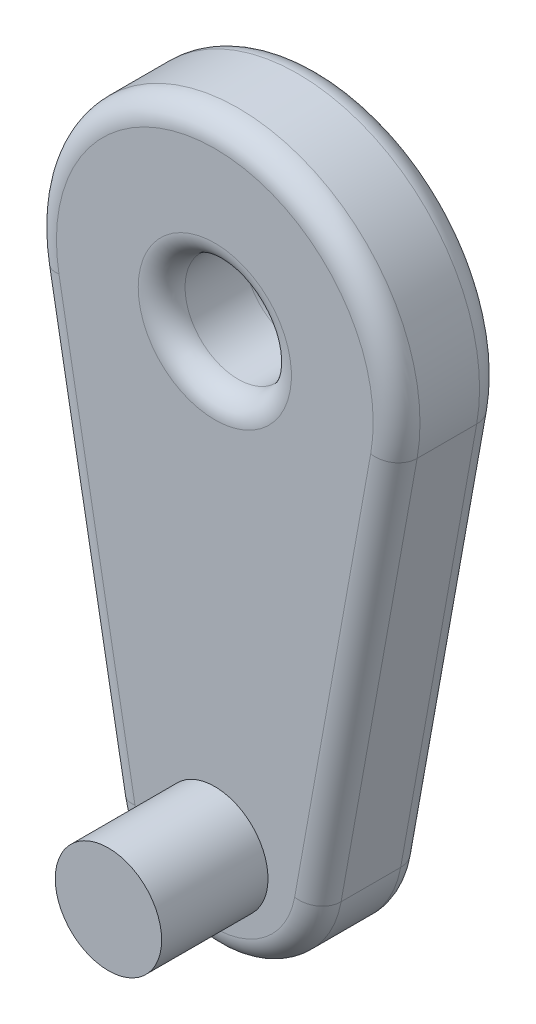
ISO-10303-21;
HEADER;
FILE_DESCRIPTION(('STEP AP214'),'2;1');
FILE_NAME('part.step','',(''),(''),'','','');
FILE_SCHEMA(('AUTOMOTIVE_DESIGN { 1 0 10303 214 1 1 1 1 }'));
ENDSEC;
DATA;
#1=APPLICATION_CONTEXT('core data for automotive mechanical design processes');
#2=APPLICATION_PROTOCOL_DEFINITION('international standard','automotive_design',2000,#1);
#3=PRODUCT_CONTEXT('',#1,'mechanical');
#4=PRODUCT('Part','Part','',(#3));
#5=PRODUCT_RELATED_PRODUCT_CATEGORY('part','',(#4));
#6=PRODUCT_DEFINITION_FORMATION('','',#4);
#7=PRODUCT_DEFINITION_CONTEXT('part definition',#1,'design');
#8=PRODUCT_DEFINITION('design','',#6,#7);
#9=PRODUCT_DEFINITION_SHAPE('','',#8);
#10=(LENGTH_UNIT() NAMED_UNIT(*) SI_UNIT(.MILLI.,.METRE.));
#11=(NAMED_UNIT(*) PLANE_ANGLE_UNIT() SI_UNIT($,.RADIAN.));
#12=(NAMED_UNIT(*) SI_UNIT($,.STERADIAN.) SOLID_ANGLE_UNIT());
#13=UNCERTAINTY_MEASURE_WITH_UNIT(LENGTH_MEASURE(1.E-05),#10,'distance_accuracy_value','');
#14=(GEOMETRIC_REPRESENTATION_CONTEXT(3) GLOBAL_UNCERTAINTY_ASSIGNED_CONTEXT((#13)) GLOBAL_UNIT_ASSIGNED_CONTEXT((#10,
#11,#12)) REPRESENTATION_CONTEXT('',''));
#15=CARTESIAN_POINT('',(0.,0.,0.));
#16=DIRECTION('',(0.,0.,1.));
#17=DIRECTION('',(1.,0.,0.));
#18=AXIS2_PLACEMENT_3D('',#15,#16,#17);
#19=CARTESIAN_POINT('',(0.,3.19993703416853,5.));
#20=DIRECTION('',(0.,0.,-1.));
#21=DIRECTION('',(-1.,0.,0.));
#22=AXIS2_PLACEMENT_3D('',#19,#20,#21);
#23=PLANE('',#22);
#24=CARTESIAN_POINT('',(0.,-17.8259501759452,5.));
#25=DIRECTION('',(0.,0.,-1.));
#26=DIRECTION('',(-1.,0.,0.));
#27=AXIS2_PLACEMENT_3D('',#24,#25,#26);
#28=CIRCLE('',#27,2.5);
#29=CARTESIAN_POINT('',(-2.5,-17.8259501759452,5.));
#30=VERTEX_POINT('',#29);
#31=EDGE_CURVE('E11',#30,#30,#28,.F.);
#32=ORIENTED_EDGE('',*,*,#31,.F.);
#33=EDGE_LOOP('',(#32));
#34=FACE_BOUND('',#33,.T.);
#35=CARTESIAN_POINT('',(0.,3.19993703416853,5.));
#36=DIRECTION('',(0.,0.,-1.));
#37=DIRECTION('',(-1.,0.,0.));
#38=AXIS2_PLACEMENT_3D('',#35,#36,#37);
#39=CIRCLE('',#38,3.6);
#40=CARTESIAN_POINT('',(-3.6,3.19993703416853,5.));
#41=VERTEX_POINT('',#40);
#42=EDGE_CURVE('E48',#41,#41,#39,.T.);
#43=ORIENTED_EDGE('',*,*,#42,.T.);
#44=EDGE_LOOP('',(#43));
#45=FACE_BOUND('',#44,.T.);
#46=CARTESIAN_POINT('',(0.,-17.277744472732,5.));
#47=DIRECTION('',(0.,0.,-1.));
#48=DIRECTION('',(-1.,0.,0.));
#49=AXIS2_PLACEMENT_3D('',#46,#47,#48);
#50=CIRCLE('',#49,3.81390108027206);
#51=CARTESIAN_POINT('',(-3.7534757200465,-17.9539555855672,5.));
#52=VERTEX_POINT('',#51);
#53=CARTESIAN_POINT('',(3.7534757200465,-17.9539555855672,5.));
#54=VERTEX_POINT('',#53);
#55=EDGE_CURVE('E55',#52,#54,#50,.F.);
#56=ORIENTED_EDGE('',*,*,#55,.T.);
#57=DIRECTION('',(0.177301691523409,0.984156547599485,0.));
#58=VECTOR('',#57,1.);
#59=CARTESIAN_POINT('',(7.3266800302686,1.87999178177352,5.));
#60=LINE('',#59,#58);
#61=CARTESIAN_POINT('',(7.3266800302686,1.87999178177352,5.));
#62=VERTEX_POINT('',#61);
#63=EDGE_CURVE('E183',#54,#62,#60,.T.);
#64=ORIENTED_EDGE('',*,*,#63,.T.);
#65=CARTESIAN_POINT('',(0.,3.19993703416853,5.));
#66=DIRECTION('',(0.,0.,-1.));
#67=DIRECTION('',(-1.,0.,0.));
#68=AXIS2_PLACEMENT_3D('',#65,#66,#67);
#69=CIRCLE('',#68,7.44462864992317);
#70=CARTESIAN_POINT('',(-7.3266800302686,1.87999178177352,5.));
#71=VERTEX_POINT('',#70);
#72=EDGE_CURVE('E176',#62,#71,#69,.F.);
#73=ORIENTED_EDGE('',*,*,#72,.T.);
#74=DIRECTION('',(0.177301691523409,-0.984156547599485,0.));
#75=VECTOR('',#74,1.);
#76=CARTESIAN_POINT('',(-7.3266800302686,1.87999178177352,5.));
#77=LINE('',#76,#75);
#78=EDGE_CURVE('E60',#71,#52,#77,.T.);
#79=ORIENTED_EDGE('',*,*,#78,.T.);
#80=EDGE_LOOP('',(#56,#64,#73,#79));
#81=FACE_BOUND('',#80,.T.);
#82=ADVANCED_FACE('F39',(#34,#45,#81),#23,.F.);
#83=CARTESIAN_POINT('',(0.,3.19993703416853,0.));
#84=DIRECTION('',(0.,0.,-1.));
#85=DIRECTION('',(-1.,0.,0.));
#86=AXIS2_PLACEMENT_3D('',#83,#84,#85);
#87=PLANE('',#86);
#88=CARTESIAN_POINT('',(0.,3.19993703416853,0.));
#89=DIRECTION('',(0.,0.,-1.));
#90=DIRECTION('',(-1.,0.,0.));
#91=AXIS2_PLACEMENT_3D('',#88,#89,#90);
#92=CIRCLE('',#91,3.6);
#93=CARTESIAN_POINT('',(-3.6,3.19993703416853,0.));
#94=VERTEX_POINT('',#93);
#95=EDGE_CURVE('E135',#94,#94,#92,.F.);
#96=ORIENTED_EDGE('',*,*,#95,.T.);
#97=EDGE_LOOP('',(#96));
#98=FACE_BOUND('',#97,.T.);
#99=CARTESIAN_POINT('',(0.,-17.277744472732,0.));
#100=DIRECTION('',(0.,0.,-1.));
#101=DIRECTION('',(-1.,0.,0.));
#102=AXIS2_PLACEMENT_3D('',#99,#100,#101);
#103=CIRCLE('',#102,3.81390108027206);
#104=CARTESIAN_POINT('',(3.7534757200465,-17.9539555855672,0.));
#105=VERTEX_POINT('',#104);
#106=CARTESIAN_POINT('',(-3.7534757200465,-17.9539555855672,0.));
#107=VERTEX_POINT('',#106);
#108=EDGE_CURVE('E133',#105,#107,#103,.T.);
#109=ORIENTED_EDGE('',*,*,#108,.T.);
#110=DIRECTION('',(0.177301691523409,-0.984156547599485,0.));
#111=VECTOR('',#110,1.);
#112=CARTESIAN_POINT('',(-7.3266800302686,1.87999178177352,0.));
#113=LINE('',#112,#111);
#114=CARTESIAN_POINT('',(-7.3266800302686,1.87999178177352,0.));
#115=VERTEX_POINT('',#114);
#116=EDGE_CURVE('E110',#107,#115,#113,.F.);
#117=ORIENTED_EDGE('',*,*,#116,.T.);
#118=CARTESIAN_POINT('',(0.,3.19993703416853,0.));
#119=DIRECTION('',(0.,0.,-1.));
#120=DIRECTION('',(-1.,0.,0.));
#121=AXIS2_PLACEMENT_3D('',#118,#119,#120);
#122=CIRCLE('',#121,7.44462864992317);
#123=CARTESIAN_POINT('',(7.3266800302686,1.87999178177352,0.));
#124=VERTEX_POINT('',#123);
#125=EDGE_CURVE('E121',#115,#124,#122,.T.);
#126=ORIENTED_EDGE('',*,*,#125,.T.);
#127=DIRECTION('',(0.177301691523409,0.984156547599485,0.));
#128=VECTOR('',#127,1.);
#129=CARTESIAN_POINT('',(3.7534757200465,-17.9539555855672,0.));
#130=LINE('',#129,#128);
#131=EDGE_CURVE('E128',#124,#105,#130,.F.);
#132=ORIENTED_EDGE('',*,*,#131,.T.);
#133=EDGE_LOOP('',(#109,#117,#126,#132));
#134=FACE_BOUND('',#133,.T.);
#135=ADVANCED_FACE('F131',(#98,#134),#87,.T.);
#136=CARTESIAN_POINT('',(0.,3.19993703416853,5.));
#137=DIRECTION('',(0.,0.,-1.));
#138=DIRECTION('',(-1.,0.,0.));
#139=AXIS2_PLACEMENT_3D('',#136,#137,#138);
#140=CYLINDRICAL_SURFACE('',#139,8.54462864992317);
#141=DIRECTION('',(0.,0.,-1.));
#142=VECTOR('',#141,1.);
#143=CARTESIAN_POINT('',(8.40925223262804,1.68495992109777,5.));
#144=LINE('',#143,#142);
#145=CARTESIAN_POINT('',(8.40925223262804,1.68495992109777,3.9));
#146=VERTEX_POINT('',#145);
#147=CARTESIAN_POINT('',(8.40925223262804,1.68495992109777,1.1));
#148=VERTEX_POINT('',#147);
#149=EDGE_CURVE('E197',#146,#148,#144,.T.);
#150=ORIENTED_EDGE('',*,*,#149,.T.);
#151=CARTESIAN_POINT('',(0.,3.19993703416853,1.1));
#152=DIRECTION('',(0.,0.,-1.));
#153=DIRECTION('',(-1.,0.,0.));
#154=AXIS2_PLACEMENT_3D('',#151,#152,#153);
#155=CIRCLE('',#154,8.54462864992317);
#156=CARTESIAN_POINT('',(-8.40925223262804,1.68495992109777,1.1));
#157=VERTEX_POINT('',#156);
#158=EDGE_CURVE('E173',#148,#157,#155,.F.);
#159=ORIENTED_EDGE('',*,*,#158,.T.);
#160=DIRECTION('',(0.,0.,-1.));
#161=VECTOR('',#160,1.);
#162=CARTESIAN_POINT('',(-8.40925223262804,1.68495992109777,5.));
#163=LINE('',#162,#161);
#164=CARTESIAN_POINT('',(-8.40925223262804,1.68495992109777,3.9));
#165=VERTEX_POINT('',#164);
#166=EDGE_CURVE('E129',#165,#157,#163,.T.);
#167=ORIENTED_EDGE('',*,*,#166,.F.);
#168=CARTESIAN_POINT('',(0.,3.19993703416853,3.9));
#169=DIRECTION('',(0.,0.,-1.));
#170=DIRECTION('',(-1.,0.,0.));
#171=AXIS2_PLACEMENT_3D('',#168,#169,#170);
#172=CIRCLE('',#171,8.54462864992317);
#173=EDGE_CURVE('E170',#165,#146,#172,.T.);
#174=ORIENTED_EDGE('',*,*,#173,.T.);
#175=EDGE_LOOP('',(#150,#159,#167,#174));
#176=FACE_BOUND('',#175,.T.);
#177=ADVANCED_FACE('F226',(#176),#140,.T.);
#178=CARTESIAN_POINT('',(-8.40925223262804,1.68495992109777,5.));
#179=DIRECTION('',(0.984156547599485,0.177301691523409,0.));
#180=DIRECTION('',(-0.177301691523409,0.984156547599485,0.));
#181=AXIS2_PLACEMENT_3D('',#178,#179,#180);
#182=PLANE('',#181);
#183=ORIENTED_EDGE('',*,*,#166,.T.);
#184=DIRECTION('',(0.177301691523409,-0.984156547599485,0.));
#185=VECTOR('',#184,1.);
#186=CARTESIAN_POINT('',(-4.83604792240594,-18.148987446243,1.1));
#187=LINE('',#186,#185);
#188=CARTESIAN_POINT('',(-4.83604792240594,-18.148987446243,1.1));
#189=VERTEX_POINT('',#188);
#190=EDGE_CURVE('E113',#157,#189,#187,.T.);
#191=ORIENTED_EDGE('',*,*,#190,.T.);
#192=DIRECTION('',(0.,0.,-1.));
#193=VECTOR('',#192,1.);
#194=CARTESIAN_POINT('',(-4.83604792240594,-18.148987446243,5.));
#195=LINE('',#194,#193);
#196=CARTESIAN_POINT('',(-4.83604792240594,-18.148987446243,3.9));
#197=VERTEX_POINT('',#196);
#198=EDGE_CURVE('E223',#197,#189,#195,.T.);
#199=ORIENTED_EDGE('',*,*,#198,.F.);
#200=DIRECTION('',(0.177301691523409,-0.984156547599485,0.));
#201=VECTOR('',#200,1.);
#202=CARTESIAN_POINT('',(-8.40925223262804,1.68495992109777,3.9));
#203=LINE('',#202,#201);
#204=EDGE_CURVE('E152',#197,#165,#203,.F.);
#205=ORIENTED_EDGE('',*,*,#204,.T.);
#206=EDGE_LOOP('',(#183,#191,#199,#205));
#207=FACE_BOUND('',#206,.T.);
#208=ADVANCED_FACE('F221',(#207),#182,.F.);
#209=CARTESIAN_POINT('',(0.,-17.277744472732,5.));
#210=DIRECTION('',(0.,0.,-1.));
#211=DIRECTION('',(-1.,0.,0.));
#212=AXIS2_PLACEMENT_3D('',#209,#210,#211);
#213=CYLINDRICAL_SURFACE('',#212,4.91390108027207);
#214=ORIENTED_EDGE('',*,*,#198,.T.);
#215=CARTESIAN_POINT('',(0.,-17.277744472732,1.1));
#216=DIRECTION('',(0.,0.,-1.));
#217=DIRECTION('',(-1.,0.,0.));
#218=AXIS2_PLACEMENT_3D('',#215,#216,#217);
#219=CIRCLE('',#218,4.91390108027207);
#220=CARTESIAN_POINT('',(4.83604792240594,-18.148987446243,1.1));
#221=VERTEX_POINT('',#220);
#222=EDGE_CURVE('E160',#189,#221,#219,.F.);
#223=ORIENTED_EDGE('',*,*,#222,.T.);
#224=DIRECTION('',(0.,0.,-1.));
#225=VECTOR('',#224,1.);
#226=CARTESIAN_POINT('',(4.83604792240594,-18.148987446243,5.));
#227=LINE('',#226,#225);
#228=CARTESIAN_POINT('',(4.83604792240594,-18.148987446243,3.9));
#229=VERTEX_POINT('',#228);
#230=EDGE_CURVE('E231',#229,#221,#227,.T.);
#231=ORIENTED_EDGE('',*,*,#230,.F.);
#232=CARTESIAN_POINT('',(0.,-17.277744472732,3.9));
#233=DIRECTION('',(0.,0.,-1.));
#234=DIRECTION('',(-1.,0.,0.));
#235=AXIS2_PLACEMENT_3D('',#232,#233,#234);
#236=CIRCLE('',#235,4.91390108027207);
#237=EDGE_CURVE('E157',#229,#197,#236,.T.);
#238=ORIENTED_EDGE('',*,*,#237,.T.);
#239=EDGE_LOOP('',(#214,#223,#231,#238));
#240=FACE_BOUND('',#239,.T.);
#241=ADVANCED_FACE('F245',(#240),#213,.T.);
#242=CARTESIAN_POINT('',(8.40925223262804,1.68495992109777,5.));
#243=DIRECTION('',(-0.984156547599485,0.177301691523409,0.));
#244=DIRECTION('',(-0.177301691523409,-0.984156547599485,0.));
#245=AXIS2_PLACEMENT_3D('',#242,#243,#244);
#246=PLANE('',#245);
#247=ORIENTED_EDGE('',*,*,#230,.T.);
#248=DIRECTION('',(0.177301691523409,0.984156547599485,0.));
#249=VECTOR('',#248,1.);
#250=CARTESIAN_POINT('',(8.40925223262804,1.68495992109777,1.1));
#251=LINE('',#250,#249);
#252=EDGE_CURVE('E167',#221,#148,#251,.T.);
#253=ORIENTED_EDGE('',*,*,#252,.T.);
#254=ORIENTED_EDGE('',*,*,#149,.F.);
#255=DIRECTION('',(0.177301691523409,0.984156547599485,0.));
#256=VECTOR('',#255,1.);
#257=CARTESIAN_POINT('',(8.40925223262804,1.68495992109777,3.9));
#258=LINE('',#257,#256);
#259=EDGE_CURVE('E163',#146,#229,#258,.F.);
#260=ORIENTED_EDGE('',*,*,#259,.T.);
#261=EDGE_LOOP('',(#247,#253,#254,#260));
#262=FACE_BOUND('',#261,.T.);
#263=ADVANCED_FACE('F278',(#262),#246,.F.);
#264=CARTESIAN_POINT('',(0.,3.19993703416853,5.));
#265=DIRECTION('',(0.,0.,-1.));
#266=DIRECTION('',(-1.,0.,0.));
#267=AXIS2_PLACEMENT_3D('',#264,#265,#266);
#268=CYLINDRICAL_SURFACE('',#267,2.5);
#269=CARTESIAN_POINT('',(0.,3.19993703416853,1.1));
#270=DIRECTION('',(0.,0.,-1.));
#271=DIRECTION('',(-1.,0.,0.));
#272=AXIS2_PLACEMENT_3D('',#269,#270,#271);
#273=CIRCLE('',#272,2.5);
#274=CARTESIAN_POINT('',(-2.5,3.19993703416853,1.1));
#275=VERTEX_POINT('',#274);
#276=EDGE_CURVE('E148',#275,#275,#273,.T.);
#277=ORIENTED_EDGE('',*,*,#276,.T.);
#278=EDGE_LOOP('',(#277));
#279=FACE_BOUND('',#278,.T.);
#280=CARTESIAN_POINT('',(0.,3.19993703416853,3.9));
#281=DIRECTION('',(0.,0.,-1.));
#282=DIRECTION('',(-1.,0.,0.));
#283=AXIS2_PLACEMENT_3D('',#280,#281,#282);
#284=CIRCLE('',#283,2.5);
#285=CARTESIAN_POINT('',(-2.5,3.19993703416853,3.9));
#286=VERTEX_POINT('',#285);
#287=EDGE_CURVE('E140',#286,#286,#284,.F.);
#288=ORIENTED_EDGE('',*,*,#287,.T.);
#289=EDGE_LOOP('',(#288));
#290=FACE_BOUND('',#289,.T.);
#291=ADVANCED_FACE('F275',(#279,#290),#268,.F.);
#292=CARTESIAN_POINT('',(0.,3.19993703416853,1.1));
#293=DIRECTION('',(0.,0.,-1.));
#294=DIRECTION('',(-1.,0.,0.));
#295=AXIS2_PLACEMENT_3D('',#292,#293,#294);
#296=TOROIDAL_SURFACE('',#295,3.6,1.1);
#297=ORIENTED_EDGE('',*,*,#276,.F.);
#298=EDGE_LOOP('',(#297));
#299=FACE_BOUND('',#298,.T.);
#300=ORIENTED_EDGE('',*,*,#95,.F.);
#301=EDGE_LOOP('',(#300));
#302=FACE_BOUND('',#301,.T.);
#303=ADVANCED_FACE('F277',(#299,#302),#296,.T.);
#304=CARTESIAN_POINT('',(7.3266800302686,1.87999178177352,1.1));
#305=DIRECTION('',(-0.177301691523409,-0.984156547599485,0.));
#306=DIRECTION('',(0.984156547599485,-0.177301691523409,0.));
#307=AXIS2_PLACEMENT_3D('',#304,#305,#306);
#308=CYLINDRICAL_SURFACE('',#307,1.1);
#309=CARTESIAN_POINT('',(3.7534757200465,-17.9539555855672,1.1));
#310=DIRECTION('',(-0.17730169152341,-0.984156547599485,0.));
#311=DIRECTION('',(0.984156547599485,-0.17730169152341,0.));
#312=AXIS2_PLACEMENT_3D('',#309,#310,#311);
#313=CIRCLE('',#312,1.1);
#314=EDGE_CURVE('E117',#105,#221,#313,.T.);
#315=ORIENTED_EDGE('',*,*,#314,.F.);
#316=ORIENTED_EDGE('',*,*,#131,.F.);
#317=CARTESIAN_POINT('',(7.3266800302686,1.87999178177352,1.1));
#318=DIRECTION('',(0.177301691523409,0.984156547599485,0.));
#319=DIRECTION('',(-0.984156547599485,0.177301691523409,0.));
#320=AXIS2_PLACEMENT_3D('',#317,#318,#319);
#321=CIRCLE('',#320,1.1);
#322=EDGE_CURVE('E124',#148,#124,#321,.T.);
#323=ORIENTED_EDGE('',*,*,#322,.F.);
#324=ORIENTED_EDGE('',*,*,#252,.F.);
#325=EDGE_LOOP('',(#315,#316,#323,#324));
#326=FACE_BOUND('',#325,.T.);
#327=ADVANCED_FACE('F238',(#326),#308,.T.);
#328=CARTESIAN_POINT('',(0.,3.19993703416853,1.1));
#329=DIRECTION('',(0.,0.,-1.));
#330=DIRECTION('',(-1.,0.,0.));
#331=AXIS2_PLACEMENT_3D('',#328,#329,#330);
#332=TOROIDAL_SURFACE('',#331,7.44462864992317,1.1);
#333=ORIENTED_EDGE('',*,*,#322,.T.);
#334=ORIENTED_EDGE('',*,*,#125,.F.);
#335=CARTESIAN_POINT('',(-7.3266800302686,1.87999178177352,1.1));
#336=DIRECTION('',(0.177301691523409,-0.984156547599485,0.));
#337=DIRECTION('',(0.984156547599485,0.177301691523409,0.));
#338=AXIS2_PLACEMENT_3D('',#335,#336,#337);
#339=CIRCLE('',#338,1.1);
#340=EDGE_CURVE('E106',#157,#115,#339,.T.);
#341=ORIENTED_EDGE('',*,*,#340,.F.);
#342=ORIENTED_EDGE('',*,*,#158,.F.);
#343=EDGE_LOOP('',(#333,#334,#341,#342));
#344=FACE_BOUND('',#343,.T.);
#345=ADVANCED_FACE('F122',(#344),#332,.T.);
#346=CARTESIAN_POINT('',(0.,-17.277744472732,1.1));
#347=DIRECTION('',(0.,0.,-1.));
#348=DIRECTION('',(-1.,0.,0.));
#349=AXIS2_PLACEMENT_3D('',#346,#347,#348);
#350=TOROIDAL_SURFACE('',#349,3.81390108027206,1.1);
#351=ORIENTED_EDGE('',*,*,#314,.T.);
#352=ORIENTED_EDGE('',*,*,#222,.F.);
#353=CARTESIAN_POINT('',(-3.7534757200465,-17.9539555855672,1.1));
#354=DIRECTION('',(-0.17730169152341,0.984156547599485,0.));
#355=DIRECTION('',(-0.984156547599485,-0.17730169152341,0.));
#356=AXIS2_PLACEMENT_3D('',#353,#354,#355);
#357=CIRCLE('',#356,1.1);
#358=EDGE_CURVE('E118',#107,#189,#357,.T.);
#359=ORIENTED_EDGE('',*,*,#358,.F.);
#360=ORIENTED_EDGE('',*,*,#108,.F.);
#361=EDGE_LOOP('',(#351,#352,#359,#360));
#362=FACE_BOUND('',#361,.T.);
#363=ADVANCED_FACE('F241',(#362),#350,.T.);
#364=CARTESIAN_POINT('',(-7.3266800302686,1.87999178177352,1.1));
#365=DIRECTION('',(-0.177301691523409,0.984156547599485,0.));
#366=DIRECTION('',(-0.984156547599485,-0.177301691523409,0.));
#367=AXIS2_PLACEMENT_3D('',#364,#365,#366);
#368=CYLINDRICAL_SURFACE('',#367,1.1);
#369=ORIENTED_EDGE('',*,*,#340,.T.);
#370=ORIENTED_EDGE('',*,*,#116,.F.);
#371=ORIENTED_EDGE('',*,*,#358,.T.);
#372=ORIENTED_EDGE('',*,*,#190,.F.);
#373=EDGE_LOOP('',(#369,#370,#371,#372));
#374=FACE_BOUND('',#373,.T.);
#375=ADVANCED_FACE('F108',(#374),#368,.T.);
#376=CARTESIAN_POINT('',(0.,3.19993703416853,3.9));
#377=DIRECTION('',(0.,0.,-1.));
#378=DIRECTION('',(-1.,0.,0.));
#379=AXIS2_PLACEMENT_3D('',#376,#377,#378);
#380=TOROIDAL_SURFACE('',#379,3.6,1.1);
#381=ORIENTED_EDGE('',*,*,#42,.F.);
#382=EDGE_LOOP('',(#381));
#383=FACE_BOUND('',#382,.T.);
#384=ORIENTED_EDGE('',*,*,#287,.F.);
#385=EDGE_LOOP('',(#384));
#386=FACE_BOUND('',#385,.T.);
#387=ADVANCED_FACE('F269',(#383,#386),#380,.T.);
#388=CARTESIAN_POINT('',(-7.3266800302686,1.87999178177352,3.9));
#389=DIRECTION('',(0.177301691523409,-0.984156547599485,0.));
#390=DIRECTION('',(0.984156547599485,0.177301691523409,0.));
#391=AXIS2_PLACEMENT_3D('',#388,#389,#390);
#392=CYLINDRICAL_SURFACE('',#391,1.1);
#393=CARTESIAN_POINT('',(-7.3266800302686,1.87999178177352,3.9));
#394=DIRECTION('',(-0.177301691523409,0.984156547599485,0.));
#395=DIRECTION('',(-0.984156547599485,-0.177301691523409,0.));
#396=AXIS2_PLACEMENT_3D('',#393,#394,#395);
#397=CIRCLE('',#396,1.1);
#398=EDGE_CURVE('E205',#165,#71,#397,.T.);
#399=ORIENTED_EDGE('',*,*,#398,.F.);
#400=ORIENTED_EDGE('',*,*,#204,.F.);
#401=CARTESIAN_POINT('',(-3.7534757200465,-17.9539555855672,3.9));
#402=DIRECTION('',(0.17730169152341,-0.984156547599485,0.));
#403=DIRECTION('',(0.984156547599485,0.17730169152341,0.));
#404=AXIS2_PLACEMENT_3D('',#401,#402,#403);
#405=CIRCLE('',#404,1.1);
#406=EDGE_CURVE('E190',#52,#197,#405,.T.);
#407=ORIENTED_EDGE('',*,*,#406,.F.);
#408=ORIENTED_EDGE('',*,*,#78,.F.);
#409=EDGE_LOOP('',(#399,#400,#407,#408));
#410=FACE_BOUND('',#409,.T.);
#411=ADVANCED_FACE('F41',(#410),#392,.T.);
#412=CARTESIAN_POINT('',(0.,-17.277744472732,3.9));
#413=DIRECTION('',(0.,0.,-1.));
#414=DIRECTION('',(-1.,0.,0.));
#415=AXIS2_PLACEMENT_3D('',#412,#413,#414);
#416=TOROIDAL_SURFACE('',#415,3.81390108027206,1.1);
#417=ORIENTED_EDGE('',*,*,#406,.T.);
#418=ORIENTED_EDGE('',*,*,#237,.F.);
#419=CARTESIAN_POINT('',(3.7534757200465,-17.9539555855672,3.9));
#420=DIRECTION('',(0.17730169152341,0.984156547599485,0.));
#421=DIRECTION('',(-0.984156547599485,0.17730169152341,0.));
#422=AXIS2_PLACEMENT_3D('',#419,#420,#421);
#423=CIRCLE('',#422,1.1);
#424=EDGE_CURVE('E201',#54,#229,#423,.T.);
#425=ORIENTED_EDGE('',*,*,#424,.F.);
#426=ORIENTED_EDGE('',*,*,#55,.F.);
#427=EDGE_LOOP('',(#417,#418,#425,#426));
#428=FACE_BOUND('',#427,.T.);
#429=ADVANCED_FACE('F212',(#428),#416,.T.);
#430=CARTESIAN_POINT('',(0.,3.19993703416853,3.9));
#431=DIRECTION('',(0.,0.,-1.));
#432=DIRECTION('',(-1.,0.,0.));
#433=AXIS2_PLACEMENT_3D('',#430,#431,#432);
#434=TOROIDAL_SURFACE('',#433,7.44462864992317,1.1);
#435=ORIENTED_EDGE('',*,*,#398,.T.);
#436=ORIENTED_EDGE('',*,*,#72,.F.);
#437=CARTESIAN_POINT('',(7.3266800302686,1.87999178177352,3.9));
#438=DIRECTION('',(-0.177301691523409,-0.984156547599485,0.));
#439=DIRECTION('',(0.984156547599485,-0.177301691523409,0.));
#440=AXIS2_PLACEMENT_3D('',#437,#438,#439);
#441=CIRCLE('',#440,1.1);
#442=EDGE_CURVE('E198',#146,#62,#441,.T.);
#443=ORIENTED_EDGE('',*,*,#442,.F.);
#444=ORIENTED_EDGE('',*,*,#173,.F.);
#445=EDGE_LOOP('',(#435,#436,#443,#444));
#446=FACE_BOUND('',#445,.T.);
#447=ADVANCED_FACE('F309',(#446),#434,.T.);
#448=CARTESIAN_POINT('',(7.3266800302686,1.87999178177352,3.9));
#449=DIRECTION('',(0.177301691523409,0.984156547599485,0.));
#450=DIRECTION('',(-0.984156547599485,0.177301691523409,0.));
#451=AXIS2_PLACEMENT_3D('',#448,#449,#450);
#452=CYLINDRICAL_SURFACE('',#451,1.1);
#453=ORIENTED_EDGE('',*,*,#424,.T.);
#454=ORIENTED_EDGE('',*,*,#259,.F.);
#455=ORIENTED_EDGE('',*,*,#442,.T.);
#456=ORIENTED_EDGE('',*,*,#63,.F.);
#457=EDGE_LOOP('',(#453,#454,#455,#456));
#458=FACE_BOUND('',#457,.T.);
#459=ADVANCED_FACE('F260',(#458),#452,.T.);
#460=CARTESIAN_POINT('',(0.,-17.8259501759452,10.));
#461=DIRECTION('',(0.,0.,-1.));
#462=DIRECTION('',(-1.,0.,0.));
#463=AXIS2_PLACEMENT_3D('',#460,#461,#462);
#464=CYLINDRICAL_SURFACE('',#463,2.5);
#465=CARTESIAN_POINT('',(0.,-17.8259501759452,10.));
#466=DIRECTION('',(0.,0.,1.));
#467=DIRECTION('',(1.,0.,0.));
#468=AXIS2_PLACEMENT_3D('',#465,#466,#467);
#469=CIRCLE('',#468,2.5);
#470=CARTESIAN_POINT('',(2.5,-17.8259501759452,10.));
#471=VERTEX_POINT('',#470);
#472=EDGE_CURVE('E202',#471,#471,#469,.T.);
#473=ORIENTED_EDGE('',*,*,#472,.F.);
#474=EDGE_LOOP('',(#473));
#475=FACE_BOUND('',#474,.T.);
#476=ORIENTED_EDGE('',*,*,#31,.T.);
#477=EDGE_LOOP('',(#476));
#478=FACE_BOUND('',#477,.T.);
#479=ADVANCED_FACE('F257',(#475,#478),#464,.T.);
#480=CARTESIAN_POINT('',(0.,-17.8259501759452,10.));
#481=DIRECTION('',(0.,0.,1.));
#482=DIRECTION('',(1.,0.,0.));
#483=AXIS2_PLACEMENT_3D('',#480,#481,#482);
#484=PLANE('',#483);
#485=ORIENTED_EDGE('',*,*,#472,.T.);
#486=EDGE_LOOP('',(#485));
#487=FACE_BOUND('',#486,.T.);
#488=ADVANCED_FACE('F255',(#487),#484,.T.);
#489=CLOSED_SHELL('',(#82,#135,#177,#208,#241,#263,#291,#303,#327,#345,#363,#375,#387,#411,#429,
#447,#459,#479,#488));
#490=MANIFOLD_SOLID_BREP('B2',#489);
#491=ADVANCED_BREP_SHAPE_REPRESENTATION('',(#18,#490),#14);
#492=SHAPE_DEFINITION_REPRESENTATION(#9,#491);
ENDSEC;
END-ISO-10303-21;
